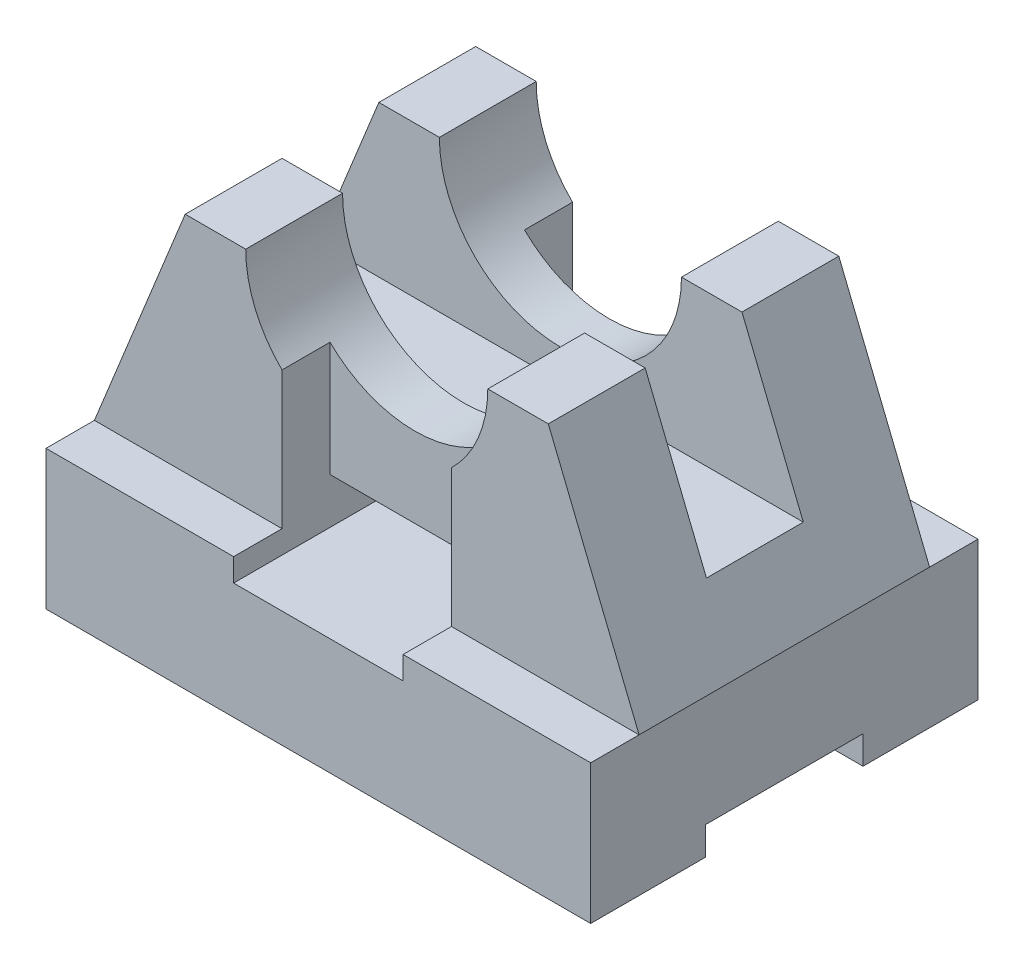
ISO-10303-21;
HEADER;
FILE_DESCRIPTION(('STEP AP214'),'2;1');
FILE_NAME('part.step','',(''),(''),'','','');
FILE_SCHEMA(('AUTOMOTIVE_DESIGN { 1 0 10303 214 1 1 1 1 }'));
ENDSEC;
DATA;
#1=APPLICATION_CONTEXT('core data for automotive mechanical design processes');
#2=APPLICATION_PROTOCOL_DEFINITION('international standard','automotive_design',2000,#1);
#3=PRODUCT_CONTEXT('',#1,'mechanical');
#4=PRODUCT('Part','Part','',(#3));
#5=PRODUCT_RELATED_PRODUCT_CATEGORY('part','',(#4));
#6=PRODUCT_DEFINITION_FORMATION('','',#4);
#7=PRODUCT_DEFINITION_CONTEXT('part definition',#1,'design');
#8=PRODUCT_DEFINITION('design','',#6,#7);
#9=PRODUCT_DEFINITION_SHAPE('','',#8);
#10=(LENGTH_UNIT() NAMED_UNIT(*) SI_UNIT(.MILLI.,.METRE.));
#11=(NAMED_UNIT(*) PLANE_ANGLE_UNIT() SI_UNIT($,.RADIAN.));
#12=(NAMED_UNIT(*) SI_UNIT($,.STERADIAN.) SOLID_ANGLE_UNIT());
#13=UNCERTAINTY_MEASURE_WITH_UNIT(LENGTH_MEASURE(1.E-05),#10,'distance_accuracy_value','');
#14=(GEOMETRIC_REPRESENTATION_CONTEXT(3) GLOBAL_UNCERTAINTY_ASSIGNED_CONTEXT((#13)) GLOBAL_UNIT_ASSIGNED_CONTEXT((#10,
#11,#12)) REPRESENTATION_CONTEXT('',''));
#15=CARTESIAN_POINT('',(0.,0.,0.));
#16=DIRECTION('',(0.,0.,1.));
#17=DIRECTION('',(1.,0.,0.));
#18=AXIS2_PLACEMENT_3D('',#15,#16,#17);
#19=CARTESIAN_POINT('',(45.,60.,-24.));
#20=DIRECTION('',(0.,0.,1.));
#21=DIRECTION('',(0.,-1.,0.));
#22=AXIS2_PLACEMENT_3D('',#19,#20,#21);
#23=PLANE('',#22);
#24=CARTESIAN_POINT('',(0.,60.,-24.));
#25=DIRECTION('',(0.,0.,1.));
#26=DIRECTION('',(0.,-1.,0.));
#27=AXIS2_PLACEMENT_3D('',#24,#25,#26);
#28=CIRCLE('',#27,20.);
#29=CARTESIAN_POINT('',(-20.,60.,-24.));
#30=VERTEX_POINT('',#29);
#31=CARTESIAN_POINT('',(-14.,45.7171431429143,-24.));
#32=VERTEX_POINT('',#31);
#33=EDGE_CURVE('E303',#30,#32,#28,.T.);
#34=ORIENTED_EDGE('',*,*,#33,.T.);
#35=DIRECTION('',(0.,1.,0.));
#36=VECTOR('',#35,1.);
#37=CARTESIAN_POINT('',(-14.,60.,-24.));
#38=LINE('',#37,#36);
#39=CARTESIAN_POINT('',(-14.,23.,-24.));
#40=VERTEX_POINT('',#39);
#41=EDGE_CURVE('E275',#40,#32,#38,.T.);
#42=ORIENTED_EDGE('',*,*,#41,.F.);
#43=DIRECTION('',(-1.,0.,0.));
#44=VECTOR('',#43,1.);
#45=CARTESIAN_POINT('',(45.,23.,-24.));
#46=LINE('',#45,#44);
#47=CARTESIAN_POINT('',(-45.,23.,-24.));
#48=VERTEX_POINT('',#47);
#49=EDGE_CURVE('E331',#40,#48,#46,.T.);
#50=ORIENTED_EDGE('',*,*,#49,.T.);
#51=DIRECTION('',(0.375705108739218,0.926739268223405,0.));
#52=VECTOR('',#51,1.);
#53=CARTESIAN_POINT('',(-45.,23.,-24.));
#54=LINE('',#53,#52);
#55=CARTESIAN_POINT('',(-30.,60.,-24.));
#56=VERTEX_POINT('',#55);
#57=EDGE_CURVE('E360',#48,#56,#54,.T.);
#58=ORIENTED_EDGE('',*,*,#57,.T.);
#59=DIRECTION('',(-1.,0.,0.));
#60=VECTOR('',#59,1.);
#61=CARTESIAN_POINT('',(45.,60.,-24.));
#62=LINE('',#61,#60);
#63=EDGE_CURVE('E340',#30,#56,#62,.T.);
#64=ORIENTED_EDGE('',*,*,#63,.F.);
#65=EDGE_LOOP('',(#34,#42,#50,#58,#64));
#66=FACE_BOUND('',#65,.T.);
#67=ADVANCED_FACE('F39',(#66),#23,.F.);
#68=DIRECTION('',(0.,-1.,0.));
#69=VECTOR('',#68,1.);
#70=CARTESIAN_POINT('',(14.,60.,-24.));
#71=LINE('',#70,#69);
#72=CARTESIAN_POINT('',(14.,45.7171431429143,-24.));
#73=VERTEX_POINT('',#72);
#74=CARTESIAN_POINT('',(14.,23.,-24.));
#75=VERTEX_POINT('',#74);
#76=EDGE_CURVE('E278',#73,#75,#71,.T.);
#77=ORIENTED_EDGE('',*,*,#76,.F.);
#78=CARTESIAN_POINT('',(20.,60.,-24.));
#79=VERTEX_POINT('',#78);
#80=EDGE_CURVE('E269',#73,#79,#28,.T.);
#81=ORIENTED_EDGE('',*,*,#80,.T.);
#82=CARTESIAN_POINT('',(30.,60.,-24.));
#83=VERTEX_POINT('',#82);
#84=EDGE_CURVE('E337',#83,#79,#62,.T.);
#85=ORIENTED_EDGE('',*,*,#84,.F.);
#86=DIRECTION('',(0.375705108739218,-0.926739268223405,0.));
#87=VECTOR('',#86,1.);
#88=CARTESIAN_POINT('',(30.,60.,-24.));
#89=LINE('',#88,#87);
#90=CARTESIAN_POINT('',(45.,23.,-24.));
#91=VERTEX_POINT('',#90);
#92=EDGE_CURVE('E461',#83,#91,#89,.T.);
#93=ORIENTED_EDGE('',*,*,#92,.T.);
#94=EDGE_CURVE('E341',#91,#75,#46,.T.);
#95=ORIENTED_EDGE('',*,*,#94,.T.);
#96=EDGE_LOOP('',(#77,#81,#85,#93,#95));
#97=FACE_BOUND('',#96,.T.);
#98=ADVANCED_FACE('F581',(#97),#23,.F.);
#99=CARTESIAN_POINT('',(-14.,60.,16.0666595449205));
#100=DIRECTION('',(0.,0.,1.));
#101=DIRECTION('',(1.,0.,0.));
#102=AXIS2_PLACEMENT_3D('',#99,#100,#101);
#103=PLANE('',#102);
#104=DIRECTION('',(0.,-1.,0.));
#105=VECTOR('',#104,1.);
#106=CARTESIAN_POINT('',(-14.,60.,16.0666595449205));
#107=LINE('',#106,#105);
#108=CARTESIAN_POINT('',(-14.,45.7171431429143,16.0666595449205));
#109=VERTEX_POINT('',#108);
#110=CARTESIAN_POINT('',(-14.,26.7853022418242,16.0666595449205));
#111=VERTEX_POINT('',#110);
#112=EDGE_CURVE('E59',#109,#111,#107,.T.);
#113=ORIENTED_EDGE('',*,*,#112,.T.);
#114=DIRECTION('',(1.,0.,0.));
#115=VECTOR('',#114,1.);
#116=CARTESIAN_POINT('',(-14.,26.7853022418242,16.0666595449205));
#117=LINE('',#116,#115);
#118=CARTESIAN_POINT('',(14.,26.7853022418242,16.0666595449205));
#119=VERTEX_POINT('',#118);
#120=EDGE_CURVE('E47',#111,#119,#117,.T.);
#121=ORIENTED_EDGE('',*,*,#120,.T.);
#122=DIRECTION('',(0.,-1.,0.));
#123=VECTOR('',#122,1.);
#124=CARTESIAN_POINT('',(14.,60.,16.0666595449205));
#125=LINE('',#124,#123);
#126=CARTESIAN_POINT('',(14.,45.7171431429143,16.0666595449205));
#127=VERTEX_POINT('',#126);
#128=EDGE_CURVE('E281',#127,#119,#125,.T.);
#129=ORIENTED_EDGE('',*,*,#128,.F.);
#130=CARTESIAN_POINT('',(0.,60.,16.0666595449205));
#131=DIRECTION('',(0.,0.,1.));
#132=DIRECTION('',(1.,0.,0.));
#133=AXIS2_PLACEMENT_3D('',#130,#131,#132);
#134=CIRCLE('',#133,20.);
#135=EDGE_CURVE('E476',#127,#109,#134,.F.);
#136=ORIENTED_EDGE('',*,*,#135,.T.);
#137=EDGE_LOOP('',(#113,#121,#129,#136));
#138=FACE_BOUND('',#137,.T.);
#139=ADVANCED_FACE('F482',(#138),#103,.T.);
#140=CARTESIAN_POINT('',(45.,60.,24.));
#141=DIRECTION('',(0.,0.,-1.));
#142=DIRECTION('',(0.,1.,0.));
#143=AXIS2_PLACEMENT_3D('',#140,#141,#142);
#144=PLANE('',#143);
#145=DIRECTION('',(0.,1.,0.));
#146=VECTOR('',#145,1.);
#147=CARTESIAN_POINT('',(14.,60.,24.));
#148=LINE('',#147,#146);
#149=CARTESIAN_POINT('',(14.,23.,24.));
#150=VERTEX_POINT('',#149);
#151=CARTESIAN_POINT('',(14.,45.7171431429143,24.));
#152=VERTEX_POINT('',#151);
#153=EDGE_CURVE('E285',#150,#152,#148,.T.);
#154=ORIENTED_EDGE('',*,*,#153,.F.);
#155=DIRECTION('',(-1.,0.,0.));
#156=VECTOR('',#155,1.);
#157=CARTESIAN_POINT('',(45.,23.,24.));
#158=LINE('',#157,#156);
#159=CARTESIAN_POINT('',(45.,23.,24.));
#160=VERTEX_POINT('',#159);
#161=EDGE_CURVE('E332',#160,#150,#158,.T.);
#162=ORIENTED_EDGE('',*,*,#161,.F.);
#163=DIRECTION('',(-0.375705108739218,0.926739268223405,0.));
#164=VECTOR('',#163,1.);
#165=CARTESIAN_POINT('',(30.,60.,24.));
#166=LINE('',#165,#164);
#167=CARTESIAN_POINT('',(30.,60.,24.));
#168=VERTEX_POINT('',#167);
#169=EDGE_CURVE('E458',#160,#168,#166,.T.);
#170=ORIENTED_EDGE('',*,*,#169,.T.);
#171=DIRECTION('',(-1.,0.,0.));
#172=VECTOR('',#171,1.);
#173=CARTESIAN_POINT('',(45.,60.,24.));
#174=LINE('',#173,#172);
#175=CARTESIAN_POINT('',(20.,60.,24.));
#176=VERTEX_POINT('',#175);
#177=EDGE_CURVE('E351',#168,#176,#174,.T.);
#178=ORIENTED_EDGE('',*,*,#177,.T.);
#179=CARTESIAN_POINT('',(0.,60.,24.));
#180=DIRECTION('',(0.,0.,-1.));
#181=DIRECTION('',(0.,1.,0.));
#182=AXIS2_PLACEMENT_3D('',#179,#180,#181);
#183=CIRCLE('',#182,20.);
#184=EDGE_CURVE('E293',#176,#152,#183,.T.);
#185=ORIENTED_EDGE('',*,*,#184,.T.);
#186=EDGE_LOOP('',(#154,#162,#170,#178,#185));
#187=FACE_BOUND('',#186,.T.);
#188=ADVANCED_FACE('F491',(#187),#144,.F.);
#189=DIRECTION('',(0.,-1.,0.));
#190=VECTOR('',#189,1.);
#191=CARTESIAN_POINT('',(-14.,60.,24.));
#192=LINE('',#191,#190);
#193=CARTESIAN_POINT('',(-14.,45.7171431429143,24.));
#194=VERTEX_POINT('',#193);
#195=CARTESIAN_POINT('',(-14.,23.,24.));
#196=VERTEX_POINT('',#195);
#197=EDGE_CURVE('E283',#194,#196,#192,.T.);
#198=ORIENTED_EDGE('',*,*,#197,.F.);
#199=CARTESIAN_POINT('',(-20.,60.,24.));
#200=VERTEX_POINT('',#199);
#201=EDGE_CURVE('E292',#194,#200,#183,.T.);
#202=ORIENTED_EDGE('',*,*,#201,.T.);
#203=CARTESIAN_POINT('',(-30.,60.,24.));
#204=VERTEX_POINT('',#203);
#205=EDGE_CURVE('E327',#200,#204,#174,.T.);
#206=ORIENTED_EDGE('',*,*,#205,.T.);
#207=DIRECTION('',(-0.375705108739218,-0.926739268223405,0.));
#208=VECTOR('',#207,1.);
#209=CARTESIAN_POINT('',(-45.,23.,24.));
#210=LINE('',#209,#208);
#211=CARTESIAN_POINT('',(-45.,23.,24.));
#212=VERTEX_POINT('',#211);
#213=EDGE_CURVE('E358',#204,#212,#210,.T.);
#214=ORIENTED_EDGE('',*,*,#213,.T.);
#215=EDGE_CURVE('E346',#196,#212,#158,.T.);
#216=ORIENTED_EDGE('',*,*,#215,.F.);
#217=EDGE_LOOP('',(#198,#202,#206,#214,#216));
#218=FACE_BOUND('',#217,.T.);
#219=ADVANCED_FACE('F512',(#218),#144,.F.);
#220=CARTESIAN_POINT('',(0.,60.,-32.));
#221=DIRECTION('',(0.,0.,1.));
#222=DIRECTION('',(1.,0.,0.));
#223=AXIS2_PLACEMENT_3D('',#220,#221,#222);
#224=CYLINDRICAL_SURFACE('',#223,20.);
#225=DIRECTION('',(0.,0.,1.));
#226=VECTOR('',#225,1.);
#227=CARTESIAN_POINT('',(14.,45.7171431429143,-32.));
#228=LINE('',#227,#226);
#229=EDGE_CURVE('E478',#152,#127,#228,.F.);
#230=ORIENTED_EDGE('',*,*,#229,.F.);
#231=ORIENTED_EDGE('',*,*,#184,.F.);
#232=DIRECTION('',(0.,0.,1.));
#233=VECTOR('',#232,1.);
#234=CARTESIAN_POINT('',(20.,60.,-32.));
#235=LINE('',#234,#233);
#236=CARTESIAN_POINT('',(20.,60.,8.));
#237=VERTEX_POINT('',#236);
#238=EDGE_CURVE('E287',#176,#237,#235,.F.);
#239=ORIENTED_EDGE('',*,*,#238,.T.);
#240=CARTESIAN_POINT('',(0.,60.,8.));
#241=DIRECTION('',(0.,0.,1.));
#242=DIRECTION('',(0.,-1.,0.));
#243=AXIS2_PLACEMENT_3D('',#240,#241,#242);
#244=CIRCLE('',#243,20.);
#245=CARTESIAN_POINT('',(-20.,60.,8.));
#246=VERTEX_POINT('',#245);
#247=EDGE_CURVE('E471',#246,#237,#244,.T.);
#248=ORIENTED_EDGE('',*,*,#247,.F.);
#249=DIRECTION('',(0.,0.,1.));
#250=VECTOR('',#249,1.);
#251=CARTESIAN_POINT('',(-20.,60.,-32.));
#252=LINE('',#251,#250);
#253=EDGE_CURVE('E289',#246,#200,#252,.T.);
#254=ORIENTED_EDGE('',*,*,#253,.T.);
#255=ORIENTED_EDGE('',*,*,#201,.F.);
#256=DIRECTION('',(0.,0.,1.));
#257=VECTOR('',#256,1.);
#258=CARTESIAN_POINT('',(-14.,45.7171431429143,-32.));
#259=LINE('',#258,#257);
#260=EDGE_CURVE('E474',#109,#194,#259,.T.);
#261=ORIENTED_EDGE('',*,*,#260,.F.);
#262=ORIENTED_EDGE('',*,*,#135,.F.);
#263=EDGE_LOOP('',(#230,#231,#239,#248,#254,#255,#261,#262));
#264=FACE_BOUND('',#263,.T.);
#265=ADVANCED_FACE('F487',(#264),#224,.F.);
#266=CARTESIAN_POINT('',(-30.,60.,-32.));
#267=DIRECTION('',(0.,1.,0.));
#268=DIRECTION('',(0.,0.,1.));
#269=AXIS2_PLACEMENT_3D('',#266,#267,#268);
#270=PLANE('',#269);
#271=DIRECTION('',(0.,0.,1.));
#272=VECTOR('',#271,1.);
#273=CARTESIAN_POINT('',(-20.,60.,-32.));
#274=LINE('',#273,#272);
#275=CARTESIAN_POINT('',(-20.,60.,-8.));
#276=VERTEX_POINT('',#275);
#277=EDGE_CURVE('E301',#30,#276,#274,.T.);
#278=ORIENTED_EDGE('',*,*,#277,.F.);
#279=ORIENTED_EDGE('',*,*,#63,.T.);
#280=DIRECTION('',(0.,0.,1.));
#281=VECTOR('',#280,1.);
#282=CARTESIAN_POINT('',(-30.,60.,-32.));
#283=LINE('',#282,#281);
#284=CARTESIAN_POINT('',(-30.,60.,-8.));
#285=VERTEX_POINT('',#284);
#286=EDGE_CURVE('E367',#56,#285,#283,.T.);
#287=ORIENTED_EDGE('',*,*,#286,.T.);
#288=DIRECTION('',(-1.,0.,0.));
#289=VECTOR('',#288,1.);
#290=CARTESIAN_POINT('',(45.,60.,-8.));
#291=LINE('',#290,#289);
#292=EDGE_CURVE('E311',#276,#285,#291,.T.);
#293=ORIENTED_EDGE('',*,*,#292,.F.);
#294=EDGE_LOOP('',(#278,#279,#287,#293));
#295=FACE_BOUND('',#294,.T.);
#296=ADVANCED_FACE('F571',(#295),#270,.T.);
#297=ORIENTED_EDGE('',*,*,#253,.F.);
#298=DIRECTION('',(-1.,0.,0.));
#299=VECTOR('',#298,1.);
#300=CARTESIAN_POINT('',(45.,60.,8.));
#301=LINE('',#300,#299);
#302=CARTESIAN_POINT('',(-30.,60.,8.));
#303=VERTEX_POINT('',#302);
#304=EDGE_CURVE('E315',#246,#303,#301,.T.);
#305=ORIENTED_EDGE('',*,*,#304,.T.);
#306=EDGE_CURVE('E371',#303,#204,#283,.T.);
#307=ORIENTED_EDGE('',*,*,#306,.T.);
#308=ORIENTED_EDGE('',*,*,#205,.F.);
#309=EDGE_LOOP('',(#297,#305,#307,#308));
#310=FACE_BOUND('',#309,.T.);
#311=ADVANCED_FACE('F506',(#310),#270,.T.);
#312=DIRECTION('',(0.,0.,1.));
#313=VECTOR('',#312,1.);
#314=CARTESIAN_POINT('',(20.,60.,-32.));
#315=LINE('',#314,#313);
#316=CARTESIAN_POINT('',(20.,60.,-8.));
#317=VERTEX_POINT('',#316);
#318=EDGE_CURVE('E299',#317,#79,#315,.F.);
#319=ORIENTED_EDGE('',*,*,#318,.F.);
#320=CARTESIAN_POINT('',(30.,60.,-8.));
#321=VERTEX_POINT('',#320);
#322=EDGE_CURVE('E307',#321,#317,#291,.T.);
#323=ORIENTED_EDGE('',*,*,#322,.F.);
#324=DIRECTION('',(0.,0.,1.));
#325=VECTOR('',#324,1.);
#326=CARTESIAN_POINT('',(30.,60.,-32.));
#327=LINE('',#326,#325);
#328=EDGE_CURVE('E372',#83,#321,#327,.T.);
#329=ORIENTED_EDGE('',*,*,#328,.F.);
#330=ORIENTED_EDGE('',*,*,#84,.T.);
#331=EDGE_LOOP('',(#319,#323,#329,#330));
#332=FACE_BOUND('',#331,.T.);
#333=ADVANCED_FACE('F578',(#332),#270,.T.);
#334=CARTESIAN_POINT('',(0.,0.,0.));
#335=DIRECTION('',(0.,-1.,0.));
#336=DIRECTION('',(0.,0.,-1.));
#337=AXIS2_PLACEMENT_3D('',#334,#335,#336);
#338=PLANE('',#337);
#339=DIRECTION('',(-1.,0.,0.));
#340=VECTOR('',#339,1.);
#341=CARTESIAN_POINT('',(0.,0.,13.));
#342=LINE('',#341,#340);
#343=CARTESIAN_POINT('',(45.,0.,13.));
#344=VERTEX_POINT('',#343);
#345=CARTESIAN_POINT('',(-45.,0.,13.));
#346=VERTEX_POINT('',#345);
#347=EDGE_CURVE('E450',#344,#346,#342,.T.);
#348=ORIENTED_EDGE('',*,*,#347,.F.);
#349=DIRECTION('',(0.,0.,-1.));
#350=VECTOR('',#349,1.);
#351=CARTESIAN_POINT('',(45.,0.,32.));
#352=LINE('',#351,#350);
#353=CARTESIAN_POINT('',(45.,0.,32.));
#354=VERTEX_POINT('',#353);
#355=EDGE_CURVE('E426',#354,#344,#352,.T.);
#356=ORIENTED_EDGE('',*,*,#355,.F.);
#357=DIRECTION('',(1.,0.,0.));
#358=VECTOR('',#357,1.);
#359=CARTESIAN_POINT('',(-45.,0.,32.));
#360=LINE('',#359,#358);
#361=CARTESIAN_POINT('',(-45.,0.,32.));
#362=VERTEX_POINT('',#361);
#363=EDGE_CURVE('E435',#362,#354,#360,.T.);
#364=ORIENTED_EDGE('',*,*,#363,.F.);
#365=DIRECTION('',(0.,0.,1.));
#366=VECTOR('',#365,1.);
#367=CARTESIAN_POINT('',(-45.,0.,32.));
#368=LINE('',#367,#366);
#369=EDGE_CURVE('E431',#346,#362,#368,.T.);
#370=ORIENTED_EDGE('',*,*,#369,.F.);
#371=EDGE_LOOP('',(#348,#356,#364,#370));
#372=FACE_BOUND('',#371,.T.);
#373=ADVANCED_FACE('F537',(#372),#338,.T.);
#374=CARTESIAN_POINT('',(45.,23.,32.));
#375=DIRECTION('',(-1.,0.,0.));
#376=DIRECTION('',(0.,0.,1.));
#377=AXIS2_PLACEMENT_3D('',#374,#375,#376);
#378=PLANE('',#377);
#379=ORIENTED_EDGE('',*,*,#355,.T.);
#380=DIRECTION('',(0.,1.,0.));
#381=VECTOR('',#380,1.);
#382=CARTESIAN_POINT('',(45.,-4.65878272400043,13.));
#383=LINE('',#382,#381);
#384=CARTESIAN_POINT('',(45.,4.65878272400043,13.));
#385=VERTEX_POINT('',#384);
#386=EDGE_CURVE('E397',#344,#385,#383,.T.);
#387=ORIENTED_EDGE('',*,*,#386,.T.);
#388=DIRECTION('',(0.,0.,-1.));
#389=VECTOR('',#388,1.);
#390=CARTESIAN_POINT('',(45.,4.65878272400043,-13.));
#391=LINE('',#390,#389);
#392=CARTESIAN_POINT('',(45.,4.65878272400043,-13.));
#393=VERTEX_POINT('',#392);
#394=EDGE_CURVE('E400',#385,#393,#391,.T.);
#395=ORIENTED_EDGE('',*,*,#394,.T.);
#396=DIRECTION('',(0.,-1.,0.));
#397=VECTOR('',#396,1.);
#398=CARTESIAN_POINT('',(45.,-4.65878272400043,-13.));
#399=LINE('',#398,#397);
#400=CARTESIAN_POINT('',(45.,0.,-13.));
#401=VERTEX_POINT('',#400);
#402=EDGE_CURVE('E404',#393,#401,#399,.T.);
#403=ORIENTED_EDGE('',*,*,#402,.T.);
#404=CARTESIAN_POINT('',(45.,0.,-32.));
#405=VERTEX_POINT('',#404);
#406=EDGE_CURVE('E415',#401,#405,#352,.T.);
#407=ORIENTED_EDGE('',*,*,#406,.T.);
#408=DIRECTION('',(0.,-1.,0.));
#409=VECTOR('',#408,1.);
#410=CARTESIAN_POINT('',(45.,23.,-32.));
#411=LINE('',#410,#409);
#412=CARTESIAN_POINT('',(45.,23.,-32.));
#413=VERTEX_POINT('',#412);
#414=EDGE_CURVE('E445',#413,#405,#411,.T.);
#415=ORIENTED_EDGE('',*,*,#414,.F.);
#416=DIRECTION('',(0.,0.,1.));
#417=VECTOR('',#416,1.);
#418=CARTESIAN_POINT('',(45.,23.,-24.));
#419=LINE('',#418,#417);
#420=EDGE_CURVE('E328',#413,#91,#419,.T.);
#421=ORIENTED_EDGE('',*,*,#420,.T.);
#422=DIRECTION('',(0.,0.,-1.));
#423=VECTOR('',#422,1.);
#424=CARTESIAN_POINT('',(45.,23.,32.));
#425=LINE('',#424,#423);
#426=EDGE_CURVE('E422',#160,#91,#425,.T.);
#427=ORIENTED_EDGE('',*,*,#426,.F.);
#428=CARTESIAN_POINT('',(45.,23.,32.));
#429=VERTEX_POINT('',#428);
#430=EDGE_CURVE('E418',#429,#160,#425,.T.);
#431=ORIENTED_EDGE('',*,*,#430,.F.);
#432=DIRECTION('',(0.,-1.,0.));
#433=VECTOR('',#432,1.);
#434=CARTESIAN_POINT('',(45.,23.,32.));
#435=LINE('',#434,#433);
#436=EDGE_CURVE('E425',#429,#354,#435,.T.);
#437=ORIENTED_EDGE('',*,*,#436,.T.);
#438=EDGE_LOOP('',(#379,#387,#395,#403,#407,#415,#421,#427,#431,#437));
#439=FACE_BOUND('',#438,.T.);
#440=ADVANCED_FACE('F41',(#439),#378,.F.);
#441=CARTESIAN_POINT('',(-45.,23.,-32.));
#442=DIRECTION('',(0.,0.,1.));
#443=DIRECTION('',(1.,0.,0.));
#444=AXIS2_PLACEMENT_3D('',#441,#442,#443);
#445=PLANE('',#444);
#446=DIRECTION('',(0.,-1.,0.));
#447=VECTOR('',#446,1.);
#448=CARTESIAN_POINT('',(-45.,23.,-32.));
#449=LINE('',#448,#447);
#450=CARTESIAN_POINT('',(-45.,23.,-32.));
#451=VERTEX_POINT('',#450);
#452=CARTESIAN_POINT('',(-45.,0.,-32.));
#453=VERTEX_POINT('',#452);
#454=EDGE_CURVE('E442',#451,#453,#449,.T.);
#455=ORIENTED_EDGE('',*,*,#454,.F.);
#456=DIRECTION('',(-1.,0.,0.));
#457=VECTOR('',#456,1.);
#458=CARTESIAN_POINT('',(45.,23.,-32.));
#459=LINE('',#458,#457);
#460=CARTESIAN_POINT('',(-14.,23.,-32.));
#461=VERTEX_POINT('',#460);
#462=EDGE_CURVE('E336',#461,#451,#459,.T.);
#463=ORIENTED_EDGE('',*,*,#462,.F.);
#464=DIRECTION('',(0.,-1.,0.));
#465=VECTOR('',#464,1.);
#466=CARTESIAN_POINT('',(-14.,19.2146977581758,-32.));
#467=LINE('',#466,#465);
#468=CARTESIAN_POINT('',(-14.,19.2146977581758,-32.));
#469=VERTEX_POINT('',#468);
#470=EDGE_CURVE('E378',#461,#469,#467,.T.);
#471=ORIENTED_EDGE('',*,*,#470,.T.);
#472=DIRECTION('',(1.,0.,0.));
#473=VECTOR('',#472,1.);
#474=CARTESIAN_POINT('',(-14.,19.2146977581758,-32.));
#475=LINE('',#474,#473);
#476=CARTESIAN_POINT('',(14.,19.2146977581758,-32.));
#477=VERTEX_POINT('',#476);
#478=EDGE_CURVE('E382',#469,#477,#475,.T.);
#479=ORIENTED_EDGE('',*,*,#478,.T.);
#480=DIRECTION('',(0.,1.,0.));
#481=VECTOR('',#480,1.);
#482=CARTESIAN_POINT('',(14.,19.2146977581758,-32.));
#483=LINE('',#482,#481);
#484=CARTESIAN_POINT('',(14.,23.,-32.));
#485=VERTEX_POINT('',#484);
#486=EDGE_CURVE('E375',#477,#485,#483,.T.);
#487=ORIENTED_EDGE('',*,*,#486,.T.);
#488=EDGE_CURVE('E333',#413,#485,#459,.T.);
#489=ORIENTED_EDGE('',*,*,#488,.F.);
#490=ORIENTED_EDGE('',*,*,#414,.T.);
#491=DIRECTION('',(-1.,0.,0.));
#492=VECTOR('',#491,1.);
#493=CARTESIAN_POINT('',(-45.,0.,-32.));
#494=LINE('',#493,#492);
#495=EDGE_CURVE('E429',#405,#453,#494,.T.);
#496=ORIENTED_EDGE('',*,*,#495,.T.);
#497=EDGE_LOOP('',(#455,#463,#471,#479,#487,#489,#490,#496));
#498=FACE_BOUND('',#497,.T.);
#499=ADVANCED_FACE('F642',(#498),#445,.F.);
#500=CARTESIAN_POINT('',(-45.,23.,32.));
#501=DIRECTION('',(1.,0.,0.));
#502=DIRECTION('',(0.,0.,-1.));
#503=AXIS2_PLACEMENT_3D('',#500,#501,#502);
#504=PLANE('',#503);
#505=DIRECTION('',(0.,0.,-1.));
#506=VECTOR('',#505,1.);
#507=CARTESIAN_POINT('',(-45.,4.65878272400043,-13.));
#508=LINE('',#507,#506);
#509=CARTESIAN_POINT('',(-45.,4.65878272400043,13.));
#510=VERTEX_POINT('',#509);
#511=CARTESIAN_POINT('',(-45.,4.65878272400043,-13.));
#512=VERTEX_POINT('',#511);
#513=EDGE_CURVE('E409',#510,#512,#508,.T.);
#514=ORIENTED_EDGE('',*,*,#513,.F.);
#515=DIRECTION('',(0.,1.,0.));
#516=VECTOR('',#515,1.);
#517=CARTESIAN_POINT('',(-45.,-4.65878272400043,13.));
#518=LINE('',#517,#516);
#519=EDGE_CURVE('E395',#346,#510,#518,.T.);
#520=ORIENTED_EDGE('',*,*,#519,.F.);
#521=ORIENTED_EDGE('',*,*,#369,.T.);
#522=DIRECTION('',(0.,-1.,0.));
#523=VECTOR('',#522,1.);
#524=CARTESIAN_POINT('',(-45.,23.,32.));
#525=LINE('',#524,#523);
#526=CARTESIAN_POINT('',(-45.,23.,32.));
#527=VERTEX_POINT('',#526);
#528=EDGE_CURVE('E439',#527,#362,#525,.T.);
#529=ORIENTED_EDGE('',*,*,#528,.F.);
#530=DIRECTION('',(0.,0.,1.));
#531=VECTOR('',#530,1.);
#532=CARTESIAN_POINT('',(-45.,23.,-32.));
#533=LINE('',#532,#531);
#534=EDGE_CURVE('E335',#212,#527,#533,.T.);
#535=ORIENTED_EDGE('',*,*,#534,.F.);
#536=DIRECTION('',(0.,0.,1.));
#537=VECTOR('',#536,1.);
#538=CARTESIAN_POINT('',(-45.,23.,32.));
#539=LINE('',#538,#537);
#540=EDGE_CURVE('E421',#48,#212,#539,.T.);
#541=ORIENTED_EDGE('',*,*,#540,.F.);
#542=EDGE_CURVE('E423',#451,#48,#539,.T.);
#543=ORIENTED_EDGE('',*,*,#542,.F.);
#544=ORIENTED_EDGE('',*,*,#454,.T.);
#545=CARTESIAN_POINT('',(-45.,0.,-13.));
#546=VERTEX_POINT('',#545);
#547=EDGE_CURVE('E432',#453,#546,#368,.T.);
#548=ORIENTED_EDGE('',*,*,#547,.T.);
#549=DIRECTION('',(0.,-1.,0.));
#550=VECTOR('',#549,1.);
#551=CARTESIAN_POINT('',(-45.,-4.65878272400043,-13.));
#552=LINE('',#551,#550);
#553=EDGE_CURVE('E401',#512,#546,#552,.T.);
#554=ORIENTED_EDGE('',*,*,#553,.F.);
#555=EDGE_LOOP('',(#514,#520,#521,#529,#535,#541,#543,#544,#548,#554));
#556=FACE_BOUND('',#555,.T.);
#557=ADVANCED_FACE('F530',(#556),#504,.F.);
#558=CARTESIAN_POINT('',(-45.,23.,32.));
#559=DIRECTION('',(0.,0.,-1.));
#560=DIRECTION('',(-1.,0.,0.));
#561=AXIS2_PLACEMENT_3D('',#558,#559,#560);
#562=PLANE('',#561);
#563=ORIENTED_EDGE('',*,*,#436,.F.);
#564=DIRECTION('',(-1.,0.,0.));
#565=VECTOR('',#564,1.);
#566=CARTESIAN_POINT('',(45.,23.,32.));
#567=LINE('',#566,#565);
#568=CARTESIAN_POINT('',(14.,23.,32.));
#569=VERTEX_POINT('',#568);
#570=EDGE_CURVE('E347',#429,#569,#567,.T.);
#571=ORIENTED_EDGE('',*,*,#570,.T.);
#572=DIRECTION('',(0.,1.,0.));
#573=VECTOR('',#572,1.);
#574=CARTESIAN_POINT('',(14.,19.2146977581758,32.));
#575=LINE('',#574,#573);
#576=CARTESIAN_POINT('',(14.,19.2146977581758,32.));
#577=VERTEX_POINT('',#576);
#578=EDGE_CURVE('E370',#577,#569,#575,.T.);
#579=ORIENTED_EDGE('',*,*,#578,.F.);
#580=DIRECTION('',(1.,0.,0.));
#581=VECTOR('',#580,1.);
#582=CARTESIAN_POINT('',(-14.,19.2146977581758,32.));
#583=LINE('',#582,#581);
#584=CARTESIAN_POINT('',(-14.,19.2146977581758,32.));
#585=VERTEX_POINT('',#584);
#586=EDGE_CURVE('E379',#585,#577,#583,.T.);
#587=ORIENTED_EDGE('',*,*,#586,.F.);
#588=DIRECTION('',(0.,-1.,0.));
#589=VECTOR('',#588,1.);
#590=CARTESIAN_POINT('',(-14.,19.2146977581758,32.));
#591=LINE('',#590,#589);
#592=CARTESIAN_POINT('',(-14.,23.,32.));
#593=VERTEX_POINT('',#592);
#594=EDGE_CURVE('E388',#593,#585,#591,.T.);
#595=ORIENTED_EDGE('',*,*,#594,.F.);
#596=EDGE_CURVE('E350',#593,#527,#567,.T.);
#597=ORIENTED_EDGE('',*,*,#596,.T.);
#598=ORIENTED_EDGE('',*,*,#528,.T.);
#599=ORIENTED_EDGE('',*,*,#363,.T.);
#600=EDGE_LOOP('',(#563,#571,#579,#587,#595,#597,#598,#599));
#601=FACE_BOUND('',#600,.T.);
#602=ADVANCED_FACE('F525',(#601),#562,.F.);
#603=DIRECTION('',(1.,0.,0.));
#604=VECTOR('',#603,1.);
#605=CARTESIAN_POINT('',(0.,0.,-13.));
#606=LINE('',#605,#604);
#607=EDGE_CURVE('E448',#546,#401,#606,.T.);
#608=ORIENTED_EDGE('',*,*,#607,.F.);
#609=ORIENTED_EDGE('',*,*,#547,.F.);
#610=ORIENTED_EDGE('',*,*,#495,.F.);
#611=ORIENTED_EDGE('',*,*,#406,.F.);
#612=EDGE_LOOP('',(#608,#609,#610,#611));
#613=FACE_BOUND('',#612,.T.);
#614=ADVANCED_FACE('F634',(#613),#338,.T.);
#615=CARTESIAN_POINT('',(45.,-4.65878272400043,13.));
#616=DIRECTION('',(0.,0.,1.));
#617=DIRECTION('',(1.,0.,0.));
#618=AXIS2_PLACEMENT_3D('',#615,#616,#617);
#619=PLANE('',#618);
#620=ORIENTED_EDGE('',*,*,#347,.T.);
#621=ORIENTED_EDGE('',*,*,#519,.T.);
#622=DIRECTION('',(-1.,0.,0.));
#623=VECTOR('',#622,1.);
#624=CARTESIAN_POINT('',(45.,4.65878272400043,13.));
#625=LINE('',#624,#623);
#626=EDGE_CURVE('E407',#385,#510,#625,.T.);
#627=ORIENTED_EDGE('',*,*,#626,.F.);
#628=ORIENTED_EDGE('',*,*,#386,.F.);
#629=EDGE_LOOP('',(#620,#621,#627,#628));
#630=FACE_BOUND('',#629,.T.);
#631=ADVANCED_FACE('F627',(#630),#619,.F.);
#632=CARTESIAN_POINT('',(45.,-4.65878272400043,-13.));
#633=DIRECTION('',(0.,0.,-1.));
#634=DIRECTION('',(-1.,0.,0.));
#635=AXIS2_PLACEMENT_3D('',#632,#633,#634);
#636=PLANE('',#635);
#637=ORIENTED_EDGE('',*,*,#607,.T.);
#638=ORIENTED_EDGE('',*,*,#402,.F.);
#639=DIRECTION('',(-1.,0.,0.));
#640=VECTOR('',#639,1.);
#641=CARTESIAN_POINT('',(45.,4.65878272400043,-13.));
#642=LINE('',#641,#640);
#643=EDGE_CURVE('E413',#393,#512,#642,.T.);
#644=ORIENTED_EDGE('',*,*,#643,.T.);
#645=ORIENTED_EDGE('',*,*,#553,.T.);
#646=EDGE_LOOP('',(#637,#638,#644,#645));
#647=FACE_BOUND('',#646,.T.);
#648=ADVANCED_FACE('F624',(#647),#636,.F.);
#649=CARTESIAN_POINT('',(45.,4.65878272400043,-13.));
#650=DIRECTION('',(0.,1.,0.));
#651=DIRECTION('',(0.,0.,1.));
#652=AXIS2_PLACEMENT_3D('',#649,#650,#651);
#653=PLANE('',#652);
#654=ORIENTED_EDGE('',*,*,#513,.T.);
#655=ORIENTED_EDGE('',*,*,#643,.F.);
#656=ORIENTED_EDGE('',*,*,#394,.F.);
#657=ORIENTED_EDGE('',*,*,#626,.T.);
#658=EDGE_LOOP('',(#654,#655,#656,#657));
#659=FACE_BOUND('',#658,.T.);
#660=ADVANCED_FACE('F623',(#659),#653,.F.);
#661=CARTESIAN_POINT('',(14.,19.2146977581758,-32.));
#662=DIRECTION('',(1.,0.,0.));
#663=DIRECTION('',(0.,0.,-1.));
#664=AXIS2_PLACEMENT_3D('',#661,#662,#663);
#665=PLANE('',#664);
#666=DIRECTION('',(0.,0.,-1.));
#667=VECTOR('',#666,1.);
#668=CARTESIAN_POINT('',(14.,26.7853022418242,32.));
#669=LINE('',#668,#667);
#670=CARTESIAN_POINT('',(14.,26.7853022418242,-16.0666595449205));
#671=VERTEX_POINT('',#670);
#672=EDGE_CURVE('E265',#119,#671,#669,.T.);
#673=ORIENTED_EDGE('',*,*,#672,.T.);
#674=DIRECTION('',(0.,-1.,0.));
#675=VECTOR('',#674,1.);
#676=CARTESIAN_POINT('',(14.,60.,-16.0666595449205));
#677=LINE('',#676,#675);
#678=CARTESIAN_POINT('',(14.,45.7171431429143,-16.0666595449205));
#679=VERTEX_POINT('',#678);
#680=EDGE_CURVE('E250',#679,#671,#677,.T.);
#681=ORIENTED_EDGE('',*,*,#680,.F.);
#682=DIRECTION('',(0.,0.,1.));
#683=VECTOR('',#682,1.);
#684=CARTESIAN_POINT('',(14.,45.7171431429143,-32.));
#685=LINE('',#684,#683);
#686=EDGE_CURVE('E257',#73,#679,#685,.T.);
#687=ORIENTED_EDGE('',*,*,#686,.F.);
#688=ORIENTED_EDGE('',*,*,#76,.T.);
#689=DIRECTION('',(0.,0.,1.));
#690=VECTOR('',#689,1.);
#691=CARTESIAN_POINT('',(14.,23.,0.));
#692=LINE('',#691,#690);
#693=EDGE_CURVE('E455',#485,#75,#692,.T.);
#694=ORIENTED_EDGE('',*,*,#693,.F.);
#695=ORIENTED_EDGE('',*,*,#486,.F.);
#696=DIRECTION('',(0.,0.,1.));
#697=VECTOR('',#696,1.);
#698=CARTESIAN_POINT('',(14.,19.2146977581758,-32.));
#699=LINE('',#698,#697);
#700=EDGE_CURVE('E393',#477,#577,#699,.T.);
#701=ORIENTED_EDGE('',*,*,#700,.T.);
#702=ORIENTED_EDGE('',*,*,#578,.T.);
#703=DIRECTION('',(0.,0.,-1.));
#704=VECTOR('',#703,1.);
#705=CARTESIAN_POINT('',(14.,23.,-32.));
#706=LINE('',#705,#704);
#707=EDGE_CURVE('E355',#569,#150,#706,.T.);
#708=ORIENTED_EDGE('',*,*,#707,.T.);
#709=ORIENTED_EDGE('',*,*,#153,.T.);
#710=ORIENTED_EDGE('',*,*,#229,.T.);
#711=ORIENTED_EDGE('',*,*,#128,.T.);
#712=EDGE_LOOP('',(#673,#681,#687,#688,#694,#695,#701,#702,#708,#709,#710,#711));
#713=FACE_BOUND('',#712,.T.);
#714=ADVANCED_FACE('F262',(#713),#665,.F.);
#715=CARTESIAN_POINT('',(-14.,19.2146977581758,-32.));
#716=DIRECTION('',(-1.,0.,0.));
#717=DIRECTION('',(0.,0.,1.));
#718=AXIS2_PLACEMENT_3D('',#715,#716,#717);
#719=PLANE('',#718);
#720=ORIENTED_EDGE('',*,*,#594,.T.);
#721=DIRECTION('',(0.,0.,1.));
#722=VECTOR('',#721,1.);
#723=CARTESIAN_POINT('',(-14.,19.2146977581758,-32.));
#724=LINE('',#723,#722);
#725=EDGE_CURVE('E385',#469,#585,#724,.T.);
#726=ORIENTED_EDGE('',*,*,#725,.F.);
#727=ORIENTED_EDGE('',*,*,#470,.F.);
#728=DIRECTION('',(0.,0.,1.));
#729=VECTOR('',#728,1.);
#730=CARTESIAN_POINT('',(-14.,23.,-32.));
#731=LINE('',#730,#729);
#732=EDGE_CURVE('E363',#461,#40,#731,.T.);
#733=ORIENTED_EDGE('',*,*,#732,.T.);
#734=ORIENTED_EDGE('',*,*,#41,.T.);
#735=DIRECTION('',(0.,0.,1.));
#736=VECTOR('',#735,1.);
#737=CARTESIAN_POINT('',(-14.,45.7171431429143,-32.));
#738=LINE('',#737,#736);
#739=CARTESIAN_POINT('',(-14.,45.7171431429143,-16.0666595449205));
#740=VERTEX_POINT('',#739);
#741=EDGE_CURVE('E256',#740,#32,#738,.F.);
#742=ORIENTED_EDGE('',*,*,#741,.F.);
#743=DIRECTION('',(0.,-1.,0.));
#744=VECTOR('',#743,1.);
#745=CARTESIAN_POINT('',(-14.,60.,-16.0666595449205));
#746=LINE('',#745,#744);
#747=CARTESIAN_POINT('',(-14.,26.7853022418242,-16.0666595449205));
#748=VERTEX_POINT('',#747);
#749=EDGE_CURVE('E252',#740,#748,#746,.T.);
#750=ORIENTED_EDGE('',*,*,#749,.T.);
#751=DIRECTION('',(0.,0.,-1.));
#752=VECTOR('',#751,1.);
#753=CARTESIAN_POINT('',(-14.,26.7853022418242,32.));
#754=LINE('',#753,#752);
#755=EDGE_CURVE('E54',#111,#748,#754,.T.);
#756=ORIENTED_EDGE('',*,*,#755,.F.);
#757=ORIENTED_EDGE('',*,*,#112,.F.);
#758=ORIENTED_EDGE('',*,*,#260,.T.);
#759=ORIENTED_EDGE('',*,*,#197,.T.);
#760=DIRECTION('',(0.,0.,-1.));
#761=VECTOR('',#760,1.);
#762=CARTESIAN_POINT('',(-14.,23.,0.));
#763=LINE('',#762,#761);
#764=EDGE_CURVE('E452',#593,#196,#763,.T.);
#765=ORIENTED_EDGE('',*,*,#764,.F.);
#766=EDGE_LOOP('',(#720,#726,#727,#733,#734,#742,#750,#756,#757,#758,#759,#765));
#767=FACE_BOUND('',#766,.T.);
#768=ADVANCED_FACE('F516',(#767),#719,.F.);
#769=CARTESIAN_POINT('',(-14.,19.2146977581758,-32.));
#770=DIRECTION('',(0.,-1.,0.));
#771=DIRECTION('',(0.,0.,-1.));
#772=AXIS2_PLACEMENT_3D('',#769,#770,#771);
#773=PLANE('',#772);
#774=ORIENTED_EDGE('',*,*,#586,.T.);
#775=ORIENTED_EDGE('',*,*,#700,.F.);
#776=ORIENTED_EDGE('',*,*,#478,.F.);
#777=ORIENTED_EDGE('',*,*,#725,.T.);
#778=EDGE_LOOP('',(#774,#775,#776,#777));
#779=FACE_BOUND('',#778,.T.);
#780=ADVANCED_FACE('F615',(#779),#773,.F.);
#781=CARTESIAN_POINT('',(-45.,23.,-32.));
#782=DIRECTION('',(-0.926739268223405,0.375705108739218,0.));
#783=DIRECTION('',(-0.375705108739218,-0.926739268223405,0.));
#784=AXIS2_PLACEMENT_3D('',#781,#782,#783);
#785=PLANE('',#784);
#786=DIRECTION('',(-0.375705108739218,-0.926739268223405,0.));
#787=VECTOR('',#786,1.);
#788=CARTESIAN_POINT('',(-45.,23.,-7.99999999999999));
#789=LINE('',#788,#787);
#790=CARTESIAN_POINT('',(-40.1351351351351,35.,-8.));
#791=VERTEX_POINT('',#790);
#792=EDGE_CURVE('E325',#285,#791,#789,.T.);
#793=ORIENTED_EDGE('',*,*,#792,.F.);
#794=ORIENTED_EDGE('',*,*,#286,.F.);
#795=ORIENTED_EDGE('',*,*,#57,.F.);
#796=ORIENTED_EDGE('',*,*,#540,.T.);
#797=ORIENTED_EDGE('',*,*,#213,.F.);
#798=ORIENTED_EDGE('',*,*,#306,.F.);
#799=DIRECTION('',(0.375705108739218,0.926739268223405,0.));
#800=VECTOR('',#799,1.);
#801=CARTESIAN_POINT('',(-45.,23.,8.));
#802=LINE('',#801,#800);
#803=CARTESIAN_POINT('',(-40.1351351351351,35.,8.));
#804=VERTEX_POINT('',#803);
#805=EDGE_CURVE('E322',#804,#303,#802,.T.);
#806=ORIENTED_EDGE('',*,*,#805,.F.);
#807=DIRECTION('',(0.,0.,1.));
#808=VECTOR('',#807,1.);
#809=CARTESIAN_POINT('',(-40.1351351351351,35.,-32.));
#810=LINE('',#809,#808);
#811=EDGE_CURVE('E310',#791,#804,#810,.T.);
#812=ORIENTED_EDGE('',*,*,#811,.F.);
#813=EDGE_LOOP('',(#793,#794,#795,#796,#797,#798,#806,#812));
#814=FACE_BOUND('',#813,.T.);
#815=ADVANCED_FACE('F554',(#814),#785,.T.);
#816=ORIENTED_EDGE('',*,*,#238,.F.);
#817=ORIENTED_EDGE('',*,*,#177,.F.);
#818=CARTESIAN_POINT('',(30.,60.,8.));
#819=VERTEX_POINT('',#818);
#820=EDGE_CURVE('E366',#819,#168,#327,.T.);
#821=ORIENTED_EDGE('',*,*,#820,.F.);
#822=EDGE_CURVE('E312',#819,#237,#301,.T.);
#823=ORIENTED_EDGE('',*,*,#822,.T.);
#824=EDGE_LOOP('',(#816,#817,#821,#823));
#825=FACE_BOUND('',#824,.T.);
#826=ADVANCED_FACE('F496',(#825),#270,.T.);
#827=CARTESIAN_POINT('',(30.,60.,-32.));
#828=DIRECTION('',(0.926739268223405,0.375705108739218,0.));
#829=DIRECTION('',(-0.375705108739218,0.926739268223405,0.));
#830=AXIS2_PLACEMENT_3D('',#827,#828,#829);
#831=PLANE('',#830);
#832=DIRECTION('',(-0.375705108739218,0.926739268223405,0.));
#833=VECTOR('',#832,1.);
#834=CARTESIAN_POINT('',(30.,60.,-8.));
#835=LINE('',#834,#833);
#836=CARTESIAN_POINT('',(40.1351351351351,35.,-8.));
#837=VERTEX_POINT('',#836);
#838=EDGE_CURVE('E469',#837,#321,#835,.T.);
#839=ORIENTED_EDGE('',*,*,#838,.F.);
#840=DIRECTION('',(0.,0.,-1.));
#841=VECTOR('',#840,1.);
#842=CARTESIAN_POINT('',(40.1351351351351,35.,-32.));
#843=LINE('',#842,#841);
#844=CARTESIAN_POINT('',(40.1351351351351,35.,8.));
#845=VERTEX_POINT('',#844);
#846=EDGE_CURVE('E464',#845,#837,#843,.T.);
#847=ORIENTED_EDGE('',*,*,#846,.F.);
#848=DIRECTION('',(0.375705108739218,-0.926739268223405,0.));
#849=VECTOR('',#848,1.);
#850=CARTESIAN_POINT('',(30.,60.,8.));
#851=LINE('',#850,#849);
#852=EDGE_CURVE('E466',#819,#845,#851,.T.);
#853=ORIENTED_EDGE('',*,*,#852,.F.);
#854=ORIENTED_EDGE('',*,*,#820,.T.);
#855=ORIENTED_EDGE('',*,*,#169,.F.);
#856=ORIENTED_EDGE('',*,*,#426,.T.);
#857=ORIENTED_EDGE('',*,*,#92,.F.);
#858=ORIENTED_EDGE('',*,*,#328,.T.);
#859=EDGE_LOOP('',(#839,#847,#853,#854,#855,#856,#857,#858));
#860=FACE_BOUND('',#859,.T.);
#861=ADVANCED_FACE('F547',(#860),#831,.T.);
#862=CARTESIAN_POINT('',(45.,23.,24.));
#863=DIRECTION('',(0.,-1.,0.));
#864=DIRECTION('',(0.,0.,-1.));
#865=AXIS2_PLACEMENT_3D('',#862,#863,#864);
#866=PLANE('',#865);
#867=ORIENTED_EDGE('',*,*,#570,.F.);
#868=ORIENTED_EDGE('',*,*,#430,.T.);
#869=ORIENTED_EDGE('',*,*,#161,.T.);
#870=ORIENTED_EDGE('',*,*,#707,.F.);
#871=EDGE_LOOP('',(#867,#868,#869,#870));
#872=FACE_BOUND('',#871,.T.);
#873=ADVANCED_FACE('F544',(#872),#866,.F.);
#874=ORIENTED_EDGE('',*,*,#215,.T.);
#875=ORIENTED_EDGE('',*,*,#534,.T.);
#876=ORIENTED_EDGE('',*,*,#596,.F.);
#877=ORIENTED_EDGE('',*,*,#764,.T.);
#878=EDGE_LOOP('',(#874,#875,#876,#877));
#879=FACE_BOUND('',#878,.T.);
#880=ADVANCED_FACE('F519',(#879),#866,.F.);
#881=CARTESIAN_POINT('',(45.,23.,-24.));
#882=DIRECTION('',(0.,-1.,0.));
#883=DIRECTION('',(0.,0.,-1.));
#884=AXIS2_PLACEMENT_3D('',#881,#882,#883);
#885=PLANE('',#884);
#886=ORIENTED_EDGE('',*,*,#94,.F.);
#887=ORIENTED_EDGE('',*,*,#420,.F.);
#888=ORIENTED_EDGE('',*,*,#488,.T.);
#889=ORIENTED_EDGE('',*,*,#693,.T.);
#890=EDGE_LOOP('',(#886,#887,#888,#889));
#891=FACE_BOUND('',#890,.T.);
#892=ADVANCED_FACE('F602',(#891),#885,.F.);
#893=ORIENTED_EDGE('',*,*,#462,.T.);
#894=ORIENTED_EDGE('',*,*,#542,.T.);
#895=ORIENTED_EDGE('',*,*,#49,.F.);
#896=ORIENTED_EDGE('',*,*,#732,.F.);
#897=EDGE_LOOP('',(#893,#894,#895,#896));
#898=FACE_BOUND('',#897,.T.);
#899=ADVANCED_FACE('F563',(#898),#885,.F.);
#900=CARTESIAN_POINT('',(45.,60.,-8.));
#901=DIRECTION('',(0.,0.,-1.));
#902=DIRECTION('',(0.,1.,0.));
#903=AXIS2_PLACEMENT_3D('',#900,#901,#902);
#904=PLANE('',#903);
#905=ORIENTED_EDGE('',*,*,#322,.T.);
#906=CARTESIAN_POINT('',(0.,60.,-8.));
#907=DIRECTION('',(0.,0.,-1.));
#908=DIRECTION('',(0.,1.,0.));
#909=AXIS2_PLACEMENT_3D('',#906,#907,#908);
#910=CIRCLE('',#909,20.);
#911=EDGE_CURVE('E296',#317,#276,#910,.T.);
#912=ORIENTED_EDGE('',*,*,#911,.T.);
#913=ORIENTED_EDGE('',*,*,#292,.T.);
#914=ORIENTED_EDGE('',*,*,#792,.T.);
#915=DIRECTION('',(-1.,0.,0.));
#916=VECTOR('',#915,1.);
#917=CARTESIAN_POINT('',(45.,35.,-8.));
#918=LINE('',#917,#916);
#919=EDGE_CURVE('E306',#837,#791,#918,.T.);
#920=ORIENTED_EDGE('',*,*,#919,.F.);
#921=ORIENTED_EDGE('',*,*,#838,.T.);
#922=EDGE_LOOP('',(#905,#912,#913,#914,#920,#921));
#923=FACE_BOUND('',#922,.T.);
#924=ADVANCED_FACE('F573',(#923),#904,.F.);
#925=CARTESIAN_POINT('',(45.,60.,8.));
#926=DIRECTION('',(0.,0.,1.));
#927=DIRECTION('',(0.,-1.,0.));
#928=AXIS2_PLACEMENT_3D('',#925,#926,#927);
#929=PLANE('',#928);
#930=ORIENTED_EDGE('',*,*,#304,.F.);
#931=ORIENTED_EDGE('',*,*,#247,.T.);
#932=ORIENTED_EDGE('',*,*,#822,.F.);
#933=ORIENTED_EDGE('',*,*,#852,.T.);
#934=DIRECTION('',(-1.,0.,0.));
#935=VECTOR('',#934,1.);
#936=CARTESIAN_POINT('',(45.,35.,8.));
#937=LINE('',#936,#935);
#938=EDGE_CURVE('E316',#845,#804,#937,.T.);
#939=ORIENTED_EDGE('',*,*,#938,.T.);
#940=ORIENTED_EDGE('',*,*,#805,.T.);
#941=EDGE_LOOP('',(#930,#931,#932,#933,#939,#940));
#942=FACE_BOUND('',#941,.T.);
#943=ADVANCED_FACE('F500',(#942),#929,.F.);
#944=CARTESIAN_POINT('',(45.,35.,-8.));
#945=DIRECTION('',(0.,-1.,0.));
#946=DIRECTION('',(0.,0.,-1.));
#947=AXIS2_PLACEMENT_3D('',#944,#945,#946);
#948=PLANE('',#947);
#949=ORIENTED_EDGE('',*,*,#811,.T.);
#950=ORIENTED_EDGE('',*,*,#938,.F.);
#951=ORIENTED_EDGE('',*,*,#846,.T.);
#952=ORIENTED_EDGE('',*,*,#919,.T.);
#953=EDGE_LOOP('',(#949,#950,#951,#952));
#954=FACE_BOUND('',#953,.T.);
#955=ADVANCED_FACE('F582',(#954),#948,.F.);
#956=CARTESIAN_POINT('',(0.,60.,-16.0666595449205));
#957=DIRECTION('',(0.,0.,1.));
#958=DIRECTION('',(1.,0.,0.));
#959=AXIS2_PLACEMENT_3D('',#956,#957,#958);
#960=CIRCLE('',#959,20.);
#961=EDGE_CURVE('E247',#679,#740,#960,.F.);
#962=ORIENTED_EDGE('',*,*,#961,.T.);
#963=ORIENTED_EDGE('',*,*,#741,.T.);
#964=ORIENTED_EDGE('',*,*,#33,.F.);
#965=ORIENTED_EDGE('',*,*,#277,.T.);
#966=ORIENTED_EDGE('',*,*,#911,.F.);
#967=ORIENTED_EDGE('',*,*,#318,.T.);
#968=ORIENTED_EDGE('',*,*,#80,.F.);
#969=ORIENTED_EDGE('',*,*,#686,.T.);
#970=EDGE_LOOP('',(#962,#963,#964,#965,#966,#967,#968,#969));
#971=FACE_BOUND('',#970,.T.);
#972=ADVANCED_FACE('F267',(#971),#224,.F.);
#973=CARTESIAN_POINT('',(-14.,26.7853022418242,32.));
#974=DIRECTION('',(0.,-1.,0.));
#975=DIRECTION('',(0.,0.,-1.));
#976=AXIS2_PLACEMENT_3D('',#973,#974,#975);
#977=PLANE('',#976);
#978=DIRECTION('',(-1.,0.,0.));
#979=VECTOR('',#978,1.);
#980=CARTESIAN_POINT('',(-14.,26.7853022418242,-16.0666595449205));
#981=LINE('',#980,#979);
#982=EDGE_CURVE('E11',#671,#748,#981,.T.);
#983=ORIENTED_EDGE('',*,*,#982,.F.);
#984=ORIENTED_EDGE('',*,*,#672,.F.);
#985=ORIENTED_EDGE('',*,*,#120,.F.);
#986=ORIENTED_EDGE('',*,*,#755,.T.);
#987=EDGE_LOOP('',(#983,#984,#985,#986));
#988=FACE_BOUND('',#987,.T.);
#989=ADVANCED_FACE('F590',(#988),#977,.T.);
#990=CARTESIAN_POINT('',(-14.,60.,-16.0666595449205));
#991=DIRECTION('',(0.,0.,1.));
#992=DIRECTION('',(1.,0.,0.));
#993=AXIS2_PLACEMENT_3D('',#990,#991,#992);
#994=PLANE('',#993);
#995=ORIENTED_EDGE('',*,*,#680,.T.);
#996=ORIENTED_EDGE('',*,*,#982,.T.);
#997=ORIENTED_EDGE('',*,*,#749,.F.);
#998=ORIENTED_EDGE('',*,*,#961,.F.);
#999=EDGE_LOOP('',(#995,#996,#997,#998));
#1000=FACE_BOUND('',#999,.T.);
#1001=ADVANCED_FACE('F249',(#1000),#994,.F.);
#1002=CLOSED_SHELL('',(#67,#98,#139,#188,#219,#265,#296,#311,#333,#373,#440,#499,#557,#602,#614,
#631,#648,#660,#714,#768,#780,#815,#826,#861,#873,#880,#892,#899,#924,#943,#955,#972,#989,#1001));
#1003=MANIFOLD_SOLID_BREP('B2',#1002);
#1004=ADVANCED_BREP_SHAPE_REPRESENTATION('',(#18,#1003),#14);
#1005=SHAPE_DEFINITION_REPRESENTATION(#9,#1004);
ENDSEC;
END-ISO-10303-21;
